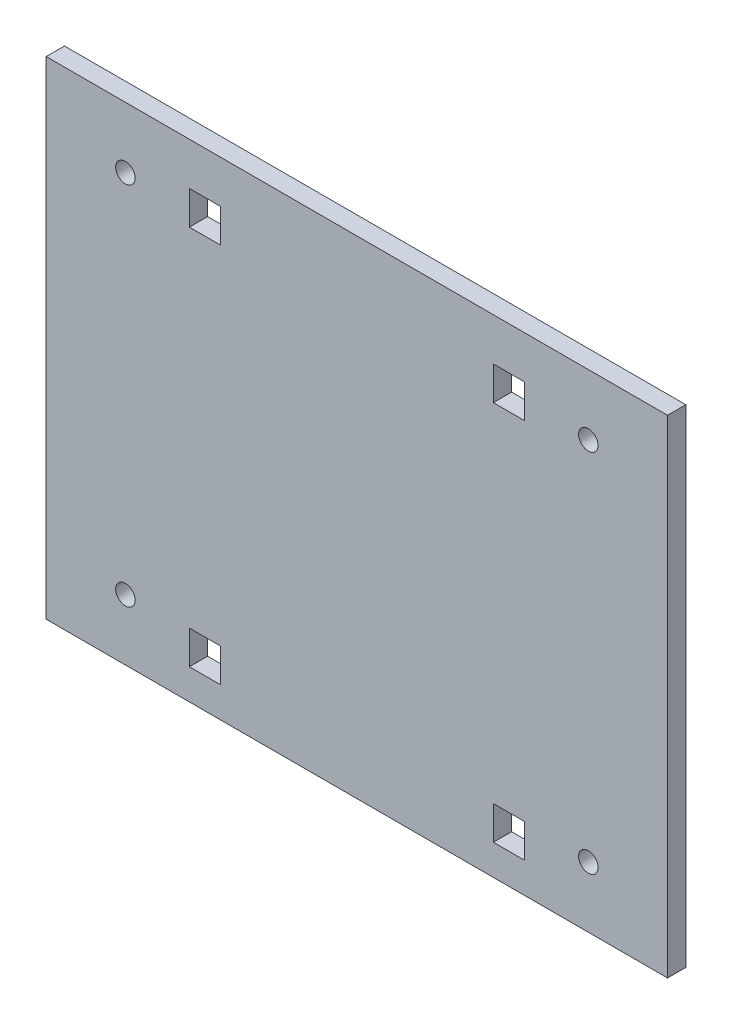
ISO-10303-21;
HEADER;
FILE_DESCRIPTION(('STEP AP214'),'2;1');
FILE_NAME('part.step','',(''),(''),'','','');
FILE_SCHEMA(('AUTOMOTIVE_DESIGN { 1 0 10303 214 1 1 1 1 }'));
ENDSEC;
DATA;
#1=APPLICATION_CONTEXT('core data for automotive mechanical design processes');
#2=APPLICATION_PROTOCOL_DEFINITION('international standard','automotive_design',2000,#1);
#3=PRODUCT_CONTEXT('',#1,'mechanical');
#4=PRODUCT('Part','Part','',(#3));
#5=PRODUCT_RELATED_PRODUCT_CATEGORY('part','',(#4));
#6=PRODUCT_DEFINITION_FORMATION('','',#4);
#7=PRODUCT_DEFINITION_CONTEXT('part definition',#1,'design');
#8=PRODUCT_DEFINITION('design','',#6,#7);
#9=PRODUCT_DEFINITION_SHAPE('','',#8);
#10=(LENGTH_UNIT() NAMED_UNIT(*) SI_UNIT(.MILLI.,.METRE.));
#11=(NAMED_UNIT(*) PLANE_ANGLE_UNIT() SI_UNIT($,.RADIAN.));
#12=(NAMED_UNIT(*) SI_UNIT($,.STERADIAN.) SOLID_ANGLE_UNIT());
#13=UNCERTAINTY_MEASURE_WITH_UNIT(LENGTH_MEASURE(1.E-05),#10,'distance_accuracy_value','');
#14=(GEOMETRIC_REPRESENTATION_CONTEXT(3) GLOBAL_UNCERTAINTY_ASSIGNED_CONTEXT((#13)) GLOBAL_UNIT_ASSIGNED_CONTEXT((#10,
#11,#12)) REPRESENTATION_CONTEXT('',''));
#15=CARTESIAN_POINT('',(0.,0.,0.));
#16=DIRECTION('',(0.,0.,1.));
#17=DIRECTION('',(1.,0.,0.));
#18=AXIS2_PLACEMENT_3D('',#15,#16,#17);
#19=CARTESIAN_POINT('',(0.,0.,3.));
#20=DIRECTION('',(0.,0.,-1.));
#21=DIRECTION('',(-1.,0.,0.));
#22=AXIS2_PLACEMENT_3D('',#19,#20,#21);
#23=PLANE('',#22);
#24=DIRECTION('',(0.,-1.,0.));
#25=VECTOR('',#24,1.);
#26=CARTESIAN_POINT('',(27.4999999985119,-94.7499999999988,3.));
#27=LINE('',#26,#25);
#28=CARTESIAN_POINT('',(27.4999999985119,-94.7499999999988,3.));
#29=VERTEX_POINT('',#28);
#30=CARTESIAN_POINT('',(27.4999999985119,-100.249999999999,3.));
#31=VERTEX_POINT('',#30);
#32=EDGE_CURVE('E212',#29,#31,#27,.T.);
#33=ORIENTED_EDGE('',*,*,#32,.T.);
#34=DIRECTION('',(-1.,0.,0.));
#35=VECTOR('',#34,1.);
#36=CARTESIAN_POINT('',(27.4999999985119,-100.249999999999,3.));
#37=LINE('',#36,#35);
#38=CARTESIAN_POINT('',(22.3999999985119,-100.249999999999,3.));
#39=VERTEX_POINT('',#38);
#40=EDGE_CURVE('E227',#31,#39,#37,.T.);
#41=ORIENTED_EDGE('',*,*,#40,.T.);
#42=DIRECTION('',(0.,1.,0.));
#43=VECTOR('',#42,1.);
#44=CARTESIAN_POINT('',(22.3999999985119,-94.7499999999988,3.));
#45=LINE('',#44,#43);
#46=CARTESIAN_POINT('',(22.3999999985119,-94.7499999999988,3.));
#47=VERTEX_POINT('',#46);
#48=EDGE_CURVE('E224',#39,#47,#45,.T.);
#49=ORIENTED_EDGE('',*,*,#48,.T.);
#50=DIRECTION('',(1.,0.,0.));
#51=VECTOR('',#50,1.);
#52=CARTESIAN_POINT('',(27.4999999985119,-94.7499999999988,3.));
#53=LINE('',#52,#51);
#54=EDGE_CURVE('E221',#47,#29,#53,.T.);
#55=ORIENTED_EDGE('',*,*,#54,.T.);
#56=EDGE_LOOP('',(#33,#41,#49,#55));
#57=FACE_BOUND('',#56,.T.);
#58=DIRECTION('',(1.,0.,0.));
#59=VECTOR('',#58,1.);
#60=CARTESIAN_POINT('',(-27.4999999985119,-100.249999999999,3.));
#61=LINE('',#60,#59);
#62=CARTESIAN_POINT('',(-27.4999999985119,-100.249999999999,3.));
#63=VERTEX_POINT('',#62);
#64=CARTESIAN_POINT('',(-22.3999999985119,-100.249999999999,3.));
#65=VERTEX_POINT('',#64);
#66=EDGE_CURVE('E241',#63,#65,#61,.T.);
#67=ORIENTED_EDGE('',*,*,#66,.F.);
#68=DIRECTION('',(0.,-1.,0.));
#69=VECTOR('',#68,1.);
#70=CARTESIAN_POINT('',(-27.4999999985119,-94.7499999999988,3.));
#71=LINE('',#70,#69);
#72=CARTESIAN_POINT('',(-27.4999999985119,-94.7499999999988,3.));
#73=VERTEX_POINT('',#72);
#74=EDGE_CURVE('E233',#73,#63,#71,.T.);
#75=ORIENTED_EDGE('',*,*,#74,.F.);
#76=DIRECTION('',(-1.,0.,0.));
#77=VECTOR('',#76,1.);
#78=CARTESIAN_POINT('',(-27.4999999985119,-94.7499999999988,3.));
#79=LINE('',#78,#77);
#80=CARTESIAN_POINT('',(-22.3999999985119,-94.7499999999988,3.));
#81=VERTEX_POINT('',#80);
#82=EDGE_CURVE('E247',#81,#73,#79,.T.);
#83=ORIENTED_EDGE('',*,*,#82,.F.);
#84=DIRECTION('',(0.,1.,0.));
#85=VECTOR('',#84,1.);
#86=CARTESIAN_POINT('',(-22.3999999985119,-94.7499999999988,3.));
#87=LINE('',#86,#85);
#88=EDGE_CURVE('E244',#65,#81,#87,.T.);
#89=ORIENTED_EDGE('',*,*,#88,.F.);
#90=EDGE_LOOP('',(#67,#75,#83,#89));
#91=FACE_BOUND('',#90,.T.);
#92=DIRECTION('',(0.,1.,0.));
#93=VECTOR('',#92,1.);
#94=CARTESIAN_POINT('',(50.9999999999784,-25.25,3.));
#95=LINE('',#94,#93);
#96=CARTESIAN_POINT('',(50.9999999999784,-105.25,3.));
#97=VERTEX_POINT('',#96);
#98=CARTESIAN_POINT('',(50.9999999999784,-25.25,3.));
#99=VERTEX_POINT('',#98);
#100=EDGE_CURVE('E284',#97,#99,#95,.T.);
#101=ORIENTED_EDGE('',*,*,#100,.T.);
#102=DIRECTION('',(-1.,0.,0.));
#103=VECTOR('',#102,1.);
#104=CARTESIAN_POINT('',(50.9999999999784,-25.25,3.));
#105=LINE('',#104,#103);
#106=CARTESIAN_POINT('',(-51.0000000000086,-25.25,3.));
#107=VERTEX_POINT('',#106);
#108=EDGE_CURVE('E287',#99,#107,#105,.T.);
#109=ORIENTED_EDGE('',*,*,#108,.T.);
#110=DIRECTION('',(0.,-1.,0.));
#111=VECTOR('',#110,1.);
#112=CARTESIAN_POINT('',(-51.0000000000086,-25.25,3.));
#113=LINE('',#112,#111);
#114=CARTESIAN_POINT('',(-51.0000000000086,-105.25,3.));
#115=VERTEX_POINT('',#114);
#116=EDGE_CURVE('E290',#107,#115,#113,.T.);
#117=ORIENTED_EDGE('',*,*,#116,.T.);
#118=DIRECTION('',(1.,0.,0.));
#119=VECTOR('',#118,1.);
#120=CARTESIAN_POINT('',(50.9999999999784,-105.25,3.));
#121=LINE('',#120,#119);
#122=EDGE_CURVE('E292',#115,#97,#121,.T.);
#123=ORIENTED_EDGE('',*,*,#122,.T.);
#124=EDGE_LOOP('',(#101,#109,#117,#123));
#125=FACE_BOUND('',#124,.T.);
#126=CARTESIAN_POINT('',(-38.0000000000219,-35.25,3.));
#127=DIRECTION('',(0.,0.,1.));
#128=DIRECTION('',(1.,0.,0.));
#129=AXIS2_PLACEMENT_3D('',#126,#127,#128);
#130=CIRCLE('',#129,1.6);
#131=CARTESIAN_POINT('',(-36.4000000000219,-35.25,3.));
#132=VERTEX_POINT('',#131);
#133=EDGE_CURVE('E278',#132,#132,#130,.T.);
#134=ORIENTED_EDGE('',*,*,#133,.F.);
#135=EDGE_LOOP('',(#134));
#136=FACE_BOUND('',#135,.T.);
#137=CARTESIAN_POINT('',(-38.0000000000219,-95.25,3.));
#138=DIRECTION('',(0.,0.,1.));
#139=DIRECTION('',(1.,0.,0.));
#140=AXIS2_PLACEMENT_3D('',#137,#138,#139);
#141=CIRCLE('',#140,1.59999999999999);
#142=CARTESIAN_POINT('',(-36.4000000000219,-95.25,3.));
#143=VERTEX_POINT('',#142);
#144=EDGE_CURVE('E272',#143,#143,#141,.T.);
#145=ORIENTED_EDGE('',*,*,#144,.F.);
#146=EDGE_LOOP('',(#145));
#147=FACE_BOUND('',#146,.T.);
#148=CARTESIAN_POINT('',(37.9999999999954,-95.25,3.));
#149=DIRECTION('',(0.,0.,1.));
#150=DIRECTION('',(1.,0.,0.));
#151=AXIS2_PLACEMENT_3D('',#148,#149,#150);
#152=CIRCLE('',#151,1.6);
#153=CARTESIAN_POINT('',(39.5999999999954,-95.25,3.));
#154=VERTEX_POINT('',#153);
#155=EDGE_CURVE('E266',#154,#154,#152,.T.);
#156=ORIENTED_EDGE('',*,*,#155,.F.);
#157=EDGE_LOOP('',(#156));
#158=FACE_BOUND('',#157,.T.);
#159=CARTESIAN_POINT('',(37.9999999999949,-35.25,3.));
#160=DIRECTION('',(0.,0.,1.));
#161=DIRECTION('',(1.,0.,0.));
#162=AXIS2_PLACEMENT_3D('',#159,#160,#161);
#163=CIRCLE('',#162,1.60000000000055);
#164=CARTESIAN_POINT('',(39.5999999999954,-35.25,3.));
#165=VERTEX_POINT('',#164);
#166=EDGE_CURVE('E260',#165,#165,#163,.T.);
#167=ORIENTED_EDGE('',*,*,#166,.F.);
#168=EDGE_LOOP('',(#167));
#169=FACE_BOUND('',#168,.T.);
#170=DIRECTION('',(1.,0.,0.));
#171=VECTOR('',#170,1.);
#172=CARTESIAN_POINT('',(-27.4999999985119,-37.7499999999988,3.));
#173=LINE('',#172,#171);
#174=CARTESIAN_POINT('',(-27.4999999985119,-37.7499999999988,3.));
#175=VERTEX_POINT('',#174);
#176=CARTESIAN_POINT('',(-22.3999999985119,-37.7499999999988,3.));
#177=VERTEX_POINT('',#176);
#178=EDGE_CURVE('E200',#175,#177,#173,.T.);
#179=ORIENTED_EDGE('',*,*,#178,.F.);
#180=DIRECTION('',(0.,-1.,0.));
#181=VECTOR('',#180,1.);
#182=CARTESIAN_POINT('',(-27.4999999985119,-32.2499999999988,3.));
#183=LINE('',#182,#181);
#184=CARTESIAN_POINT('',(-27.4999999985119,-32.2499999999988,3.));
#185=VERTEX_POINT('',#184);
#186=EDGE_CURVE('E196',#185,#175,#183,.T.);
#187=ORIENTED_EDGE('',*,*,#186,.F.);
#188=DIRECTION('',(-1.,0.,0.));
#189=VECTOR('',#188,1.);
#190=CARTESIAN_POINT('',(-27.4999999985119,-32.2499999999988,3.));
#191=LINE('',#190,#189);
#192=CARTESIAN_POINT('',(-22.3999999985119,-32.2499999999988,3.));
#193=VERTEX_POINT('',#192);
#194=EDGE_CURVE('E206',#193,#185,#191,.T.);
#195=ORIENTED_EDGE('',*,*,#194,.F.);
#196=DIRECTION('',(0.,1.,0.));
#197=VECTOR('',#196,1.);
#198=CARTESIAN_POINT('',(-22.3999999985119,-32.2499999999988,3.));
#199=LINE('',#198,#197);
#200=EDGE_CURVE('E203',#177,#193,#199,.T.);
#201=ORIENTED_EDGE('',*,*,#200,.F.);
#202=EDGE_LOOP('',(#179,#187,#195,#201));
#203=FACE_BOUND('',#202,.T.);
#204=DIRECTION('',(0.,-1.,0.));
#205=VECTOR('',#204,1.);
#206=CARTESIAN_POINT('',(27.4999999985119,-32.2499999999988,3.));
#207=LINE('',#206,#205);
#208=CARTESIAN_POINT('',(27.4999999985119,-32.2499999999988,3.));
#209=VERTEX_POINT('',#208);
#210=CARTESIAN_POINT('',(27.4999999985119,-37.7499999999988,3.));
#211=VERTEX_POINT('',#210);
#212=EDGE_CURVE('E50',#209,#211,#207,.T.);
#213=ORIENTED_EDGE('',*,*,#212,.T.);
#214=DIRECTION('',(-1.,0.,0.));
#215=VECTOR('',#214,1.);
#216=CARTESIAN_POINT('',(27.4999999985119,-37.7499999999988,3.));
#217=LINE('',#216,#215);
#218=CARTESIAN_POINT('',(22.3999999985119,-37.7499999999988,3.));
#219=VERTEX_POINT('',#218);
#220=EDGE_CURVE('E189',#211,#219,#217,.T.);
#221=ORIENTED_EDGE('',*,*,#220,.T.);
#222=DIRECTION('',(0.,1.,0.));
#223=VECTOR('',#222,1.);
#224=CARTESIAN_POINT('',(22.3999999985119,-32.2499999999988,3.));
#225=LINE('',#224,#223);
#226=CARTESIAN_POINT('',(22.3999999985119,-32.2499999999988,3.));
#227=VERTEX_POINT('',#226);
#228=EDGE_CURVE('E175',#219,#227,#225,.T.);
#229=ORIENTED_EDGE('',*,*,#228,.T.);
#230=DIRECTION('',(1.,0.,0.));
#231=VECTOR('',#230,1.);
#232=CARTESIAN_POINT('',(27.4999999985119,-32.2499999999988,3.));
#233=LINE('',#232,#231);
#234=EDGE_CURVE('E184',#227,#209,#233,.T.);
#235=ORIENTED_EDGE('',*,*,#234,.T.);
#236=EDGE_LOOP('',(#213,#221,#229,#235));
#237=FACE_BOUND('',#236,.T.);
#238=ADVANCED_FACE('F35',(#57,#91,#125,#136,#147,#158,#169,#203,#237),#23,.F.);
#239=CARTESIAN_POINT('',(0.,0.,0.));
#240=DIRECTION('',(0.,0.,-1.));
#241=DIRECTION('',(-1.,0.,0.));
#242=AXIS2_PLACEMENT_3D('',#239,#240,#241);
#243=PLANE('',#242);
#244=DIRECTION('',(0.,1.,0.));
#245=VECTOR('',#244,1.);
#246=CARTESIAN_POINT('',(-27.4999999985119,0.,0.));
#247=LINE('',#246,#245);
#248=CARTESIAN_POINT('',(-27.4999999985119,-37.7499999999988,0.));
#249=VERTEX_POINT('',#248);
#250=CARTESIAN_POINT('',(-27.4999999985119,-32.2499999999988,0.));
#251=VERTEX_POINT('',#250);
#252=EDGE_CURVE('E341',#249,#251,#247,.T.);
#253=ORIENTED_EDGE('',*,*,#252,.F.);
#254=DIRECTION('',(-1.,0.,0.));
#255=VECTOR('',#254,1.);
#256=CARTESIAN_POINT('',(0.,-37.7499999999988,0.));
#257=LINE('',#256,#255);
#258=CARTESIAN_POINT('',(-22.3999999985119,-37.7499999999988,0.));
#259=VERTEX_POINT('',#258);
#260=EDGE_CURVE('E334',#259,#249,#257,.T.);
#261=ORIENTED_EDGE('',*,*,#260,.F.);
#262=DIRECTION('',(0.,-1.,0.));
#263=VECTOR('',#262,1.);
#264=CARTESIAN_POINT('',(-22.3999999985119,0.,0.));
#265=LINE('',#264,#263);
#266=CARTESIAN_POINT('',(-22.3999999985119,-32.2499999999988,0.));
#267=VERTEX_POINT('',#266);
#268=EDGE_CURVE('E336',#267,#259,#265,.T.);
#269=ORIENTED_EDGE('',*,*,#268,.F.);
#270=DIRECTION('',(1.,0.,0.));
#271=VECTOR('',#270,1.);
#272=CARTESIAN_POINT('',(0.,-32.2499999999988,0.));
#273=LINE('',#272,#271);
#274=EDGE_CURVE('E339',#251,#267,#273,.T.);
#275=ORIENTED_EDGE('',*,*,#274,.F.);
#276=EDGE_LOOP('',(#253,#261,#269,#275));
#277=FACE_BOUND('',#276,.T.);
#278=DIRECTION('',(0.,1.,0.));
#279=VECTOR('',#278,1.);
#280=CARTESIAN_POINT('',(-27.4999999985119,0.,0.));
#281=LINE('',#280,#279);
#282=CARTESIAN_POINT('',(-27.4999999985119,-100.249999999999,0.));
#283=VERTEX_POINT('',#282);
#284=CARTESIAN_POINT('',(-27.4999999985119,-94.7499999999988,0.));
#285=VERTEX_POINT('',#284);
#286=EDGE_CURVE('E320',#283,#285,#281,.T.);
#287=ORIENTED_EDGE('',*,*,#286,.F.);
#288=DIRECTION('',(-1.,0.,0.));
#289=VECTOR('',#288,1.);
#290=CARTESIAN_POINT('',(0.,-100.249999999999,0.));
#291=LINE('',#290,#289);
#292=CARTESIAN_POINT('',(-22.3999999985119,-100.249999999999,0.));
#293=VERTEX_POINT('',#292);
#294=EDGE_CURVE('E313',#293,#283,#291,.T.);
#295=ORIENTED_EDGE('',*,*,#294,.F.);
#296=DIRECTION('',(0.,-1.,0.));
#297=VECTOR('',#296,1.);
#298=CARTESIAN_POINT('',(-22.3999999985119,0.,0.));
#299=LINE('',#298,#297);
#300=CARTESIAN_POINT('',(-22.3999999985119,-94.7499999999988,0.));
#301=VERTEX_POINT('',#300);
#302=EDGE_CURVE('E315',#301,#293,#299,.T.);
#303=ORIENTED_EDGE('',*,*,#302,.F.);
#304=DIRECTION('',(1.,0.,0.));
#305=VECTOR('',#304,1.);
#306=CARTESIAN_POINT('',(0.,-94.7499999999988,0.));
#307=LINE('',#306,#305);
#308=EDGE_CURVE('E318',#285,#301,#307,.T.);
#309=ORIENTED_EDGE('',*,*,#308,.F.);
#310=EDGE_LOOP('',(#287,#295,#303,#309));
#311=FACE_BOUND('',#310,.T.);
#312=CARTESIAN_POINT('',(37.9999999999954,-95.25,0.));
#313=DIRECTION('',(0.,0.,1.));
#314=DIRECTION('',(1.,0.,0.));
#315=AXIS2_PLACEMENT_3D('',#312,#313,#314);
#316=CIRCLE('',#315,1.6);
#317=CARTESIAN_POINT('',(39.5999999999954,-95.25,0.));
#318=VERTEX_POINT('',#317);
#319=EDGE_CURVE('E263',#318,#318,#316,.T.);
#320=ORIENTED_EDGE('',*,*,#319,.T.);
#321=EDGE_LOOP('',(#320));
#322=FACE_BOUND('',#321,.T.);
#323=CARTESIAN_POINT('',(-38.0000000000219,-35.25,0.));
#324=DIRECTION('',(0.,0.,1.));
#325=DIRECTION('',(1.,0.,0.));
#326=AXIS2_PLACEMENT_3D('',#323,#324,#325);
#327=CIRCLE('',#326,1.6);
#328=CARTESIAN_POINT('',(-36.4000000000219,-35.25,0.));
#329=VERTEX_POINT('',#328);
#330=EDGE_CURVE('E275',#329,#329,#327,.T.);
#331=ORIENTED_EDGE('',*,*,#330,.T.);
#332=EDGE_LOOP('',(#331));
#333=FACE_BOUND('',#332,.T.);
#334=DIRECTION('',(0.,1.,0.));
#335=VECTOR('',#334,1.);
#336=CARTESIAN_POINT('',(50.9999999999784,-25.25,0.));
#337=LINE('',#336,#335);
#338=CARTESIAN_POINT('',(50.9999999999784,-105.25,0.));
#339=VERTEX_POINT('',#338);
#340=CARTESIAN_POINT('',(50.9999999999784,-25.25,0.));
#341=VERTEX_POINT('',#340);
#342=EDGE_CURVE('E281',#339,#341,#337,.T.);
#343=ORIENTED_EDGE('',*,*,#342,.F.);
#344=DIRECTION('',(1.,0.,0.));
#345=VECTOR('',#344,1.);
#346=CARTESIAN_POINT('',(50.9999999999784,-105.25,0.));
#347=LINE('',#346,#345);
#348=CARTESIAN_POINT('',(-51.0000000000086,-105.25,0.));
#349=VERTEX_POINT('',#348);
#350=EDGE_CURVE('E288',#349,#339,#347,.T.);
#351=ORIENTED_EDGE('',*,*,#350,.F.);
#352=DIRECTION('',(0.,-1.,0.));
#353=VECTOR('',#352,1.);
#354=CARTESIAN_POINT('',(-51.0000000000086,-25.25,0.));
#355=LINE('',#354,#353);
#356=CARTESIAN_POINT('',(-51.0000000000086,-25.25,0.));
#357=VERTEX_POINT('',#356);
#358=EDGE_CURVE('E299',#357,#349,#355,.T.);
#359=ORIENTED_EDGE('',*,*,#358,.F.);
#360=DIRECTION('',(-1.,0.,0.));
#361=VECTOR('',#360,1.);
#362=CARTESIAN_POINT('',(50.9999999999784,-25.25,0.));
#363=LINE('',#362,#361);
#364=EDGE_CURVE('E297',#341,#357,#363,.T.);
#365=ORIENTED_EDGE('',*,*,#364,.F.);
#366=EDGE_LOOP('',(#343,#351,#359,#365));
#367=FACE_BOUND('',#366,.T.);
#368=CARTESIAN_POINT('',(-38.0000000000219,-95.25,0.));
#369=DIRECTION('',(0.,0.,1.));
#370=DIRECTION('',(1.,0.,0.));
#371=AXIS2_PLACEMENT_3D('',#368,#369,#370);
#372=CIRCLE('',#371,1.59999999999999);
#373=CARTESIAN_POINT('',(-36.4000000000219,-95.25,0.));
#374=VERTEX_POINT('',#373);
#375=EDGE_CURVE('E269',#374,#374,#372,.T.);
#376=ORIENTED_EDGE('',*,*,#375,.T.);
#377=EDGE_LOOP('',(#376));
#378=FACE_BOUND('',#377,.T.);
#379=CARTESIAN_POINT('',(37.9999999999949,-35.25,0.));
#380=DIRECTION('',(0.,0.,1.));
#381=DIRECTION('',(1.,0.,0.));
#382=AXIS2_PLACEMENT_3D('',#379,#380,#381);
#383=CIRCLE('',#382,1.60000000000055);
#384=CARTESIAN_POINT('',(39.5999999999954,-35.25,0.));
#385=VERTEX_POINT('',#384);
#386=EDGE_CURVE('E253',#385,#385,#383,.T.);
#387=ORIENTED_EDGE('',*,*,#386,.T.);
#388=EDGE_LOOP('',(#387));
#389=FACE_BOUND('',#388,.T.);
#390=DIRECTION('',(1.,0.,0.));
#391=VECTOR('',#390,1.);
#392=CARTESIAN_POINT('',(0.,-100.249999999999,0.));
#393=LINE('',#392,#391);
#394=CARTESIAN_POINT('',(22.3999999985119,-100.249999999999,0.));
#395=VERTEX_POINT('',#394);
#396=CARTESIAN_POINT('',(27.4999999985119,-100.249999999999,0.));
#397=VERTEX_POINT('',#396);
#398=EDGE_CURVE('E328',#395,#397,#393,.T.);
#399=ORIENTED_EDGE('',*,*,#398,.T.);
#400=DIRECTION('',(0.,1.,0.));
#401=VECTOR('',#400,1.);
#402=CARTESIAN_POINT('',(27.4999999985119,0.,0.));
#403=LINE('',#402,#401);
#404=CARTESIAN_POINT('',(27.4999999985119,-94.7499999999988,0.));
#405=VERTEX_POINT('',#404);
#406=EDGE_CURVE('E331',#397,#405,#403,.T.);
#407=ORIENTED_EDGE('',*,*,#406,.T.);
#408=DIRECTION('',(-1.,0.,0.));
#409=VECTOR('',#408,1.);
#410=CARTESIAN_POINT('',(0.,-94.7499999999988,0.));
#411=LINE('',#410,#409);
#412=CARTESIAN_POINT('',(22.3999999985119,-94.7499999999988,0.));
#413=VERTEX_POINT('',#412);
#414=EDGE_CURVE('E322',#405,#413,#411,.T.);
#415=ORIENTED_EDGE('',*,*,#414,.T.);
#416=DIRECTION('',(0.,-1.,0.));
#417=VECTOR('',#416,1.);
#418=CARTESIAN_POINT('',(22.3999999985119,0.,0.));
#419=LINE('',#418,#417);
#420=EDGE_CURVE('E325',#413,#395,#419,.T.);
#421=ORIENTED_EDGE('',*,*,#420,.T.);
#422=EDGE_LOOP('',(#399,#407,#415,#421));
#423=FACE_BOUND('',#422,.T.);
#424=DIRECTION('',(1.,0.,0.));
#425=VECTOR('',#424,1.);
#426=CARTESIAN_POINT('',(0.,-37.7499999999988,0.));
#427=LINE('',#426,#425);
#428=CARTESIAN_POINT('',(22.3999999985119,-37.7499999999988,0.));
#429=VERTEX_POINT('',#428);
#430=CARTESIAN_POINT('',(27.4999999985119,-37.7499999999988,0.));
#431=VERTEX_POINT('',#430);
#432=EDGE_CURVE('E43',#429,#431,#427,.T.);
#433=ORIENTED_EDGE('',*,*,#432,.T.);
#434=DIRECTION('',(0.,1.,0.));
#435=VECTOR('',#434,1.);
#436=CARTESIAN_POINT('',(27.4999999985119,0.,0.));
#437=LINE('',#436,#435);
#438=CARTESIAN_POINT('',(27.4999999985119,-32.2499999999988,0.));
#439=VERTEX_POINT('',#438);
#440=EDGE_CURVE('E11',#431,#439,#437,.T.);
#441=ORIENTED_EDGE('',*,*,#440,.T.);
#442=DIRECTION('',(-1.,0.,0.));
#443=VECTOR('',#442,1.);
#444=CARTESIAN_POINT('',(0.,-32.2499999999988,0.));
#445=LINE('',#444,#443);
#446=CARTESIAN_POINT('',(22.3999999985119,-32.2499999999988,0.));
#447=VERTEX_POINT('',#446);
#448=EDGE_CURVE('E343',#439,#447,#445,.T.);
#449=ORIENTED_EDGE('',*,*,#448,.T.);
#450=DIRECTION('',(0.,-1.,0.));
#451=VECTOR('',#450,1.);
#452=CARTESIAN_POINT('',(22.3999999985119,0.,0.));
#453=LINE('',#452,#451);
#454=EDGE_CURVE('E178',#447,#429,#453,.T.);
#455=ORIENTED_EDGE('',*,*,#454,.T.);
#456=EDGE_LOOP('',(#433,#441,#449,#455));
#457=FACE_BOUND('',#456,.T.);
#458=ADVANCED_FACE('F347',(#277,#311,#322,#333,#367,#378,#389,#423,#457),#243,.T.);
#459=CARTESIAN_POINT('',(50.9999999999784,-25.25,3.));
#460=DIRECTION('',(-1.,0.,0.));
#461=DIRECTION('',(0.,0.,1.));
#462=AXIS2_PLACEMENT_3D('',#459,#460,#461);
#463=PLANE('',#462);
#464=ORIENTED_EDGE('',*,*,#342,.T.);
#465=DIRECTION('',(0.,0.,-1.));
#466=VECTOR('',#465,1.);
#467=CARTESIAN_POINT('',(50.9999999999784,-25.25,3.));
#468=LINE('',#467,#466);
#469=EDGE_CURVE('E310',#99,#341,#468,.T.);
#470=ORIENTED_EDGE('',*,*,#469,.F.);
#471=ORIENTED_EDGE('',*,*,#100,.F.);
#472=DIRECTION('',(0.,0.,-1.));
#473=VECTOR('',#472,1.);
#474=CARTESIAN_POINT('',(50.9999999999784,-105.25,3.));
#475=LINE('',#474,#473);
#476=EDGE_CURVE('E294',#97,#339,#475,.T.);
#477=ORIENTED_EDGE('',*,*,#476,.T.);
#478=EDGE_LOOP('',(#464,#470,#471,#477));
#479=FACE_BOUND('',#478,.T.);
#480=ADVANCED_FACE('F37',(#479),#463,.F.);
#481=CARTESIAN_POINT('',(50.9999999999784,-25.25,3.));
#482=DIRECTION('',(0.,-1.,0.));
#483=DIRECTION('',(0.,0.,-1.));
#484=AXIS2_PLACEMENT_3D('',#481,#482,#483);
#485=PLANE('',#484);
#486=ORIENTED_EDGE('',*,*,#364,.T.);
#487=DIRECTION('',(0.,0.,-1.));
#488=VECTOR('',#487,1.);
#489=CARTESIAN_POINT('',(-51.0000000000086,-25.25,3.));
#490=LINE('',#489,#488);
#491=EDGE_CURVE('E307',#107,#357,#490,.T.);
#492=ORIENTED_EDGE('',*,*,#491,.F.);
#493=ORIENTED_EDGE('',*,*,#108,.F.);
#494=ORIENTED_EDGE('',*,*,#469,.T.);
#495=EDGE_LOOP('',(#486,#492,#493,#494));
#496=FACE_BOUND('',#495,.T.);
#497=ADVANCED_FACE('F384',(#496),#485,.F.);
#498=CARTESIAN_POINT('',(-51.0000000000086,-25.25,3.));
#499=DIRECTION('',(1.,0.,0.));
#500=DIRECTION('',(0.,0.,-1.));
#501=AXIS2_PLACEMENT_3D('',#498,#499,#500);
#502=PLANE('',#501);
#503=ORIENTED_EDGE('',*,*,#358,.T.);
#504=DIRECTION('',(0.,0.,-1.));
#505=VECTOR('',#504,1.);
#506=CARTESIAN_POINT('',(-51.0000000000086,-105.25,3.));
#507=LINE('',#506,#505);
#508=EDGE_CURVE('E304',#115,#349,#507,.T.);
#509=ORIENTED_EDGE('',*,*,#508,.F.);
#510=ORIENTED_EDGE('',*,*,#116,.F.);
#511=ORIENTED_EDGE('',*,*,#491,.T.);
#512=EDGE_LOOP('',(#503,#509,#510,#511));
#513=FACE_BOUND('',#512,.T.);
#514=ADVANCED_FACE('F381',(#513),#502,.F.);
#515=CARTESIAN_POINT('',(50.9999999999784,-105.25,3.));
#516=DIRECTION('',(0.,1.,0.));
#517=DIRECTION('',(0.,0.,1.));
#518=AXIS2_PLACEMENT_3D('',#515,#516,#517);
#519=PLANE('',#518);
#520=ORIENTED_EDGE('',*,*,#350,.T.);
#521=ORIENTED_EDGE('',*,*,#476,.F.);
#522=ORIENTED_EDGE('',*,*,#122,.F.);
#523=ORIENTED_EDGE('',*,*,#508,.T.);
#524=EDGE_LOOP('',(#520,#521,#522,#523));
#525=FACE_BOUND('',#524,.T.);
#526=ADVANCED_FACE('F378',(#525),#519,.F.);
#527=CARTESIAN_POINT('',(-38.0000000000219,-35.25,3.));
#528=DIRECTION('',(0.,0.,-1.));
#529=DIRECTION('',(-1.,0.,0.));
#530=AXIS2_PLACEMENT_3D('',#527,#528,#529);
#531=CYLINDRICAL_SURFACE('',#530,1.6);
#532=ORIENTED_EDGE('',*,*,#133,.T.);
#533=EDGE_LOOP('',(#532));
#534=FACE_BOUND('',#533,.T.);
#535=ORIENTED_EDGE('',*,*,#330,.F.);
#536=EDGE_LOOP('',(#535));
#537=FACE_BOUND('',#536,.T.);
#538=ADVANCED_FACE('F375',(#534,#537),#531,.F.);
#539=CARTESIAN_POINT('',(-38.0000000000219,-95.25,3.));
#540=DIRECTION('',(0.,0.,-1.));
#541=DIRECTION('',(-1.,0.,0.));
#542=AXIS2_PLACEMENT_3D('',#539,#540,#541);
#543=CYLINDRICAL_SURFACE('',#542,1.59999999999999);
#544=ORIENTED_EDGE('',*,*,#144,.T.);
#545=EDGE_LOOP('',(#544));
#546=FACE_BOUND('',#545,.T.);
#547=ORIENTED_EDGE('',*,*,#375,.F.);
#548=EDGE_LOOP('',(#547));
#549=FACE_BOUND('',#548,.T.);
#550=ADVANCED_FACE('F477',(#546,#549),#543,.F.);
#551=CARTESIAN_POINT('',(37.9999999999954,-95.25,3.));
#552=DIRECTION('',(0.,0.,-1.));
#553=DIRECTION('',(-1.,0.,0.));
#554=AXIS2_PLACEMENT_3D('',#551,#552,#553);
#555=CYLINDRICAL_SURFACE('',#554,1.6);
#556=ORIENTED_EDGE('',*,*,#155,.T.);
#557=EDGE_LOOP('',(#556));
#558=FACE_BOUND('',#557,.T.);
#559=ORIENTED_EDGE('',*,*,#319,.F.);
#560=EDGE_LOOP('',(#559));
#561=FACE_BOUND('',#560,.T.);
#562=ADVANCED_FACE('F474',(#558,#561),#555,.F.);
#563=CARTESIAN_POINT('',(37.9999999999949,-35.25,3.));
#564=DIRECTION('',(0.,0.,-1.));
#565=DIRECTION('',(-1.,0.,0.));
#566=AXIS2_PLACEMENT_3D('',#563,#564,#565);
#567=CYLINDRICAL_SURFACE('',#566,1.60000000000055);
#568=ORIENTED_EDGE('',*,*,#166,.T.);
#569=EDGE_LOOP('',(#568));
#570=FACE_BOUND('',#569,.T.);
#571=ORIENTED_EDGE('',*,*,#386,.F.);
#572=EDGE_LOOP('',(#571));
#573=FACE_BOUND('',#572,.T.);
#574=ADVANCED_FACE('F470',(#570,#573),#567,.F.);
#575=CARTESIAN_POINT('',(-27.4999999985119,-94.7499999999988,-2.));
#576=DIRECTION('',(-1.,0.,0.));
#577=DIRECTION('',(0.,0.,1.));
#578=AXIS2_PLACEMENT_3D('',#575,#576,#577);
#579=PLANE('',#578);
#580=ORIENTED_EDGE('',*,*,#286,.T.);
#581=DIRECTION('',(0.,0.,1.));
#582=VECTOR('',#581,1.);
#583=CARTESIAN_POINT('',(-27.4999999985119,-94.7499999999988,-2.));
#584=LINE('',#583,#582);
#585=EDGE_CURVE('E251',#285,#73,#584,.T.);
#586=ORIENTED_EDGE('',*,*,#585,.T.);
#587=ORIENTED_EDGE('',*,*,#74,.T.);
#588=DIRECTION('',(0.,0.,1.));
#589=VECTOR('',#588,1.);
#590=CARTESIAN_POINT('',(-27.4999999985119,-100.249999999999,-2.));
#591=LINE('',#590,#589);
#592=EDGE_CURVE('E250',#283,#63,#591,.T.);
#593=ORIENTED_EDGE('',*,*,#592,.F.);
#594=EDGE_LOOP('',(#580,#586,#587,#593));
#595=FACE_BOUND('',#594,.T.);
#596=ADVANCED_FACE('F460',(#595),#579,.F.);
#597=CARTESIAN_POINT('',(-27.4999999985119,-94.7499999999988,-2.));
#598=DIRECTION('',(0.,1.,0.));
#599=DIRECTION('',(0.,0.,1.));
#600=AXIS2_PLACEMENT_3D('',#597,#598,#599);
#601=PLANE('',#600);
#602=ORIENTED_EDGE('',*,*,#308,.T.);
#603=DIRECTION('',(0.,0.,1.));
#604=VECTOR('',#603,1.);
#605=CARTESIAN_POINT('',(-22.3999999985119,-94.7499999999988,-2.));
#606=LINE('',#605,#604);
#607=EDGE_CURVE('E254',#301,#81,#606,.T.);
#608=ORIENTED_EDGE('',*,*,#607,.T.);
#609=ORIENTED_EDGE('',*,*,#82,.T.);
#610=ORIENTED_EDGE('',*,*,#585,.F.);
#611=EDGE_LOOP('',(#602,#608,#609,#610));
#612=FACE_BOUND('',#611,.T.);
#613=ADVANCED_FACE('F456',(#612),#601,.F.);
#614=CARTESIAN_POINT('',(-22.3999999985119,-94.7499999999988,-2.));
#615=DIRECTION('',(1.,0.,0.));
#616=DIRECTION('',(0.,0.,-1.));
#617=AXIS2_PLACEMENT_3D('',#614,#615,#616);
#618=PLANE('',#617);
#619=ORIENTED_EDGE('',*,*,#302,.T.);
#620=DIRECTION('',(0.,0.,1.));
#621=VECTOR('',#620,1.);
#622=CARTESIAN_POINT('',(-22.3999999985119,-100.249999999999,-2.));
#623=LINE('',#622,#621);
#624=EDGE_CURVE('E256',#293,#65,#623,.T.);
#625=ORIENTED_EDGE('',*,*,#624,.T.);
#626=ORIENTED_EDGE('',*,*,#88,.T.);
#627=ORIENTED_EDGE('',*,*,#607,.F.);
#628=EDGE_LOOP('',(#619,#625,#626,#627));
#629=FACE_BOUND('',#628,.T.);
#630=ADVANCED_FACE('F459',(#629),#618,.F.);
#631=CARTESIAN_POINT('',(-27.4999999985119,-100.249999999999,-2.));
#632=DIRECTION('',(0.,-1.,0.));
#633=DIRECTION('',(0.,0.,-1.));
#634=AXIS2_PLACEMENT_3D('',#631,#632,#633);
#635=PLANE('',#634);
#636=ORIENTED_EDGE('',*,*,#294,.T.);
#637=ORIENTED_EDGE('',*,*,#592,.T.);
#638=ORIENTED_EDGE('',*,*,#66,.T.);
#639=ORIENTED_EDGE('',*,*,#624,.F.);
#640=EDGE_LOOP('',(#636,#637,#638,#639));
#641=FACE_BOUND('',#640,.T.);
#642=ADVANCED_FACE('F454',(#641),#635,.F.);
#643=CARTESIAN_POINT('',(27.4999999985119,-94.7499999999988,-2.));
#644=DIRECTION('',(-1.,0.,0.));
#645=DIRECTION('',(0.,0.,1.));
#646=AXIS2_PLACEMENT_3D('',#643,#644,#645);
#647=PLANE('',#646);
#648=DIRECTION('',(0.,0.,1.));
#649=VECTOR('',#648,1.);
#650=CARTESIAN_POINT('',(27.4999999985119,-100.249999999999,-2.));
#651=LINE('',#650,#649);
#652=EDGE_CURVE('E231',#397,#31,#651,.T.);
#653=ORIENTED_EDGE('',*,*,#652,.T.);
#654=ORIENTED_EDGE('',*,*,#32,.F.);
#655=DIRECTION('',(0.,0.,1.));
#656=VECTOR('',#655,1.);
#657=CARTESIAN_POINT('',(27.4999999985119,-94.7499999999988,-2.));
#658=LINE('',#657,#656);
#659=EDGE_CURVE('E230',#405,#29,#658,.T.);
#660=ORIENTED_EDGE('',*,*,#659,.F.);
#661=ORIENTED_EDGE('',*,*,#406,.F.);
#662=EDGE_LOOP('',(#653,#654,#660,#661));
#663=FACE_BOUND('',#662,.T.);
#664=ADVANCED_FACE('F444',(#663),#647,.T.);
#665=CARTESIAN_POINT('',(27.4999999985119,-100.249999999999,-2.));
#666=DIRECTION('',(0.,1.,0.));
#667=DIRECTION('',(0.,0.,1.));
#668=AXIS2_PLACEMENT_3D('',#665,#666,#667);
#669=PLANE('',#668);
#670=DIRECTION('',(0.,0.,1.));
#671=VECTOR('',#670,1.);
#672=CARTESIAN_POINT('',(22.3999999985119,-100.249999999999,-2.));
#673=LINE('',#672,#671);
#674=EDGE_CURVE('E234',#395,#39,#673,.T.);
#675=ORIENTED_EDGE('',*,*,#674,.T.);
#676=ORIENTED_EDGE('',*,*,#40,.F.);
#677=ORIENTED_EDGE('',*,*,#652,.F.);
#678=ORIENTED_EDGE('',*,*,#398,.F.);
#679=EDGE_LOOP('',(#675,#676,#677,#678));
#680=FACE_BOUND('',#679,.T.);
#681=ADVANCED_FACE('F440',(#680),#669,.T.);
#682=CARTESIAN_POINT('',(22.3999999985119,-94.7499999999988,-2.));
#683=DIRECTION('',(1.,0.,0.));
#684=DIRECTION('',(0.,0.,-1.));
#685=AXIS2_PLACEMENT_3D('',#682,#683,#684);
#686=PLANE('',#685);
#687=DIRECTION('',(0.,0.,1.));
#688=VECTOR('',#687,1.);
#689=CARTESIAN_POINT('',(22.3999999985119,-94.7499999999988,-2.));
#690=LINE('',#689,#688);
#691=EDGE_CURVE('E236',#413,#47,#690,.T.);
#692=ORIENTED_EDGE('',*,*,#691,.T.);
#693=ORIENTED_EDGE('',*,*,#48,.F.);
#694=ORIENTED_EDGE('',*,*,#674,.F.);
#695=ORIENTED_EDGE('',*,*,#420,.F.);
#696=EDGE_LOOP('',(#692,#693,#694,#695));
#697=FACE_BOUND('',#696,.T.);
#698=ADVANCED_FACE('F443',(#697),#686,.T.);
#699=CARTESIAN_POINT('',(27.4999999985119,-94.7499999999988,-2.));
#700=DIRECTION('',(0.,-1.,0.));
#701=DIRECTION('',(0.,0.,-1.));
#702=AXIS2_PLACEMENT_3D('',#699,#700,#701);
#703=PLANE('',#702);
#704=ORIENTED_EDGE('',*,*,#659,.T.);
#705=ORIENTED_EDGE('',*,*,#54,.F.);
#706=ORIENTED_EDGE('',*,*,#691,.F.);
#707=ORIENTED_EDGE('',*,*,#414,.F.);
#708=EDGE_LOOP('',(#704,#705,#706,#707));
#709=FACE_BOUND('',#708,.T.);
#710=ADVANCED_FACE('F439',(#709),#703,.T.);
#711=CARTESIAN_POINT('',(-27.4999999985119,-32.2499999999988,-2.));
#712=DIRECTION('',(-1.,0.,0.));
#713=DIRECTION('',(0.,0.,1.));
#714=AXIS2_PLACEMENT_3D('',#711,#712,#713);
#715=PLANE('',#714);
#716=ORIENTED_EDGE('',*,*,#252,.T.);
#717=DIRECTION('',(0.,0.,1.));
#718=VECTOR('',#717,1.);
#719=CARTESIAN_POINT('',(-27.4999999985119,-32.2499999999988,-2.));
#720=LINE('',#719,#718);
#721=EDGE_CURVE('E210',#251,#185,#720,.T.);
#722=ORIENTED_EDGE('',*,*,#721,.T.);
#723=ORIENTED_EDGE('',*,*,#186,.T.);
#724=DIRECTION('',(0.,0.,1.));
#725=VECTOR('',#724,1.);
#726=CARTESIAN_POINT('',(-27.4999999985119,-37.7499999999988,-2.));
#727=LINE('',#726,#725);
#728=EDGE_CURVE('E209',#249,#175,#727,.T.);
#729=ORIENTED_EDGE('',*,*,#728,.F.);
#730=EDGE_LOOP('',(#716,#722,#723,#729));
#731=FACE_BOUND('',#730,.T.);
#732=ADVANCED_FACE('F422',(#731),#715,.F.);
#733=CARTESIAN_POINT('',(-27.4999999985119,-32.2499999999988,-2.));
#734=DIRECTION('',(0.,1.,0.));
#735=DIRECTION('',(0.,0.,1.));
#736=AXIS2_PLACEMENT_3D('',#733,#734,#735);
#737=PLANE('',#736);
#738=ORIENTED_EDGE('',*,*,#274,.T.);
#739=DIRECTION('',(0.,0.,1.));
#740=VECTOR('',#739,1.);
#741=CARTESIAN_POINT('',(-22.3999999985119,-32.2499999999988,-2.));
#742=LINE('',#741,#740);
#743=EDGE_CURVE('E213',#267,#193,#742,.T.);
#744=ORIENTED_EDGE('',*,*,#743,.T.);
#745=ORIENTED_EDGE('',*,*,#194,.T.);
#746=ORIENTED_EDGE('',*,*,#721,.F.);
#747=EDGE_LOOP('',(#738,#744,#745,#746));
#748=FACE_BOUND('',#747,.T.);
#749=ADVANCED_FACE('F429',(#748),#737,.F.);
#750=CARTESIAN_POINT('',(-22.3999999985119,-32.2499999999988,-2.));
#751=DIRECTION('',(1.,0.,0.));
#752=DIRECTION('',(0.,0.,-1.));
#753=AXIS2_PLACEMENT_3D('',#750,#751,#752);
#754=PLANE('',#753);
#755=ORIENTED_EDGE('',*,*,#268,.T.);
#756=DIRECTION('',(0.,0.,1.));
#757=VECTOR('',#756,1.);
#758=CARTESIAN_POINT('',(-22.3999999985119,-37.7499999999988,-2.));
#759=LINE('',#758,#757);
#760=EDGE_CURVE('E215',#259,#177,#759,.T.);
#761=ORIENTED_EDGE('',*,*,#760,.T.);
#762=ORIENTED_EDGE('',*,*,#200,.T.);
#763=ORIENTED_EDGE('',*,*,#743,.F.);
#764=EDGE_LOOP('',(#755,#761,#762,#763));
#765=FACE_BOUND('',#764,.T.);
#766=ADVANCED_FACE('F360',(#765),#754,.F.);
#767=CARTESIAN_POINT('',(-27.4999999985119,-37.7499999999988,-2.));
#768=DIRECTION('',(0.,-1.,0.));
#769=DIRECTION('',(0.,0.,-1.));
#770=AXIS2_PLACEMENT_3D('',#767,#768,#769);
#771=PLANE('',#770);
#772=ORIENTED_EDGE('',*,*,#260,.T.);
#773=ORIENTED_EDGE('',*,*,#728,.T.);
#774=ORIENTED_EDGE('',*,*,#178,.T.);
#775=ORIENTED_EDGE('',*,*,#760,.F.);
#776=EDGE_LOOP('',(#772,#773,#774,#775));
#777=FACE_BOUND('',#776,.T.);
#778=ADVANCED_FACE('F353',(#777),#771,.F.);
#779=CARTESIAN_POINT('',(27.4999999985119,-32.2499999999988,-2.));
#780=DIRECTION('',(-1.,0.,0.));
#781=DIRECTION('',(0.,0.,1.));
#782=AXIS2_PLACEMENT_3D('',#779,#780,#781);
#783=PLANE('',#782);
#784=DIRECTION('',(0.,0.,1.));
#785=VECTOR('',#784,1.);
#786=CARTESIAN_POINT('',(27.4999999985119,-37.7499999999988,-2.));
#787=LINE('',#786,#785);
#788=EDGE_CURVE('E194',#431,#211,#787,.T.);
#789=ORIENTED_EDGE('',*,*,#788,.T.);
#790=ORIENTED_EDGE('',*,*,#212,.F.);
#791=DIRECTION('',(0.,0.,1.));
#792=VECTOR('',#791,1.);
#793=CARTESIAN_POINT('',(27.4999999985119,-32.2499999999988,-2.));
#794=LINE('',#793,#792);
#795=EDGE_CURVE('E181',#439,#209,#794,.T.);
#796=ORIENTED_EDGE('',*,*,#795,.F.);
#797=ORIENTED_EDGE('',*,*,#440,.F.);
#798=EDGE_LOOP('',(#789,#790,#796,#797));
#799=FACE_BOUND('',#798,.T.);
#800=ADVANCED_FACE('F351',(#799),#783,.T.);
#801=CARTESIAN_POINT('',(27.4999999985119,-37.7499999999988,-2.));
#802=DIRECTION('',(0.,1.,0.));
#803=DIRECTION('',(0.,0.,1.));
#804=AXIS2_PLACEMENT_3D('',#801,#802,#803);
#805=PLANE('',#804);
#806=DIRECTION('',(0.,0.,1.));
#807=VECTOR('',#806,1.);
#808=CARTESIAN_POINT('',(22.3999999985119,-37.7499999999988,-2.));
#809=LINE('',#808,#807);
#810=EDGE_CURVE('E180',#429,#219,#809,.T.);
#811=ORIENTED_EDGE('',*,*,#810,.T.);
#812=ORIENTED_EDGE('',*,*,#220,.F.);
#813=ORIENTED_EDGE('',*,*,#788,.F.);
#814=ORIENTED_EDGE('',*,*,#432,.F.);
#815=EDGE_LOOP('',(#811,#812,#813,#814));
#816=FACE_BOUND('',#815,.T.);
#817=ADVANCED_FACE('F350',(#816),#805,.T.);
#818=CARTESIAN_POINT('',(22.3999999985119,-32.2499999999988,-2.));
#819=DIRECTION('',(1.,0.,0.));
#820=DIRECTION('',(0.,0.,-1.));
#821=AXIS2_PLACEMENT_3D('',#818,#819,#820);
#822=PLANE('',#821);
#823=DIRECTION('',(0.,0.,1.));
#824=VECTOR('',#823,1.);
#825=CARTESIAN_POINT('',(22.3999999985119,-32.2499999999988,-2.));
#826=LINE('',#825,#824);
#827=EDGE_CURVE('E58',#447,#227,#826,.T.);
#828=ORIENTED_EDGE('',*,*,#827,.T.);
#829=ORIENTED_EDGE('',*,*,#228,.F.);
#830=ORIENTED_EDGE('',*,*,#810,.F.);
#831=ORIENTED_EDGE('',*,*,#454,.F.);
#832=EDGE_LOOP('',(#828,#829,#830,#831));
#833=FACE_BOUND('',#832,.T.);
#834=ADVANCED_FACE('F172',(#833),#822,.T.);
#835=CARTESIAN_POINT('',(27.4999999985119,-32.2499999999988,-2.));
#836=DIRECTION('',(0.,-1.,0.));
#837=DIRECTION('',(0.,0.,-1.));
#838=AXIS2_PLACEMENT_3D('',#835,#836,#837);
#839=PLANE('',#838);
#840=ORIENTED_EDGE('',*,*,#795,.T.);
#841=ORIENTED_EDGE('',*,*,#234,.F.);
#842=ORIENTED_EDGE('',*,*,#827,.F.);
#843=ORIENTED_EDGE('',*,*,#448,.F.);
#844=EDGE_LOOP('',(#840,#841,#842,#843));
#845=FACE_BOUND('',#844,.T.);
#846=ADVANCED_FACE('F185',(#845),#839,.T.);
#847=CLOSED_SHELL('',(#238,#458,#480,#497,#514,#526,#538,#550,#562,#574,#596,#613,#630,#642,
#664,#681,#698,#710,#732,#749,#766,#778,#800,#817,#834,#846));
#848=MANIFOLD_SOLID_BREP('B2',#847);
#849=ADVANCED_BREP_SHAPE_REPRESENTATION('',(#18,#848),#14);
#850=SHAPE_DEFINITION_REPRESENTATION(#9,#849);
ENDSEC;
END-ISO-10303-21;
